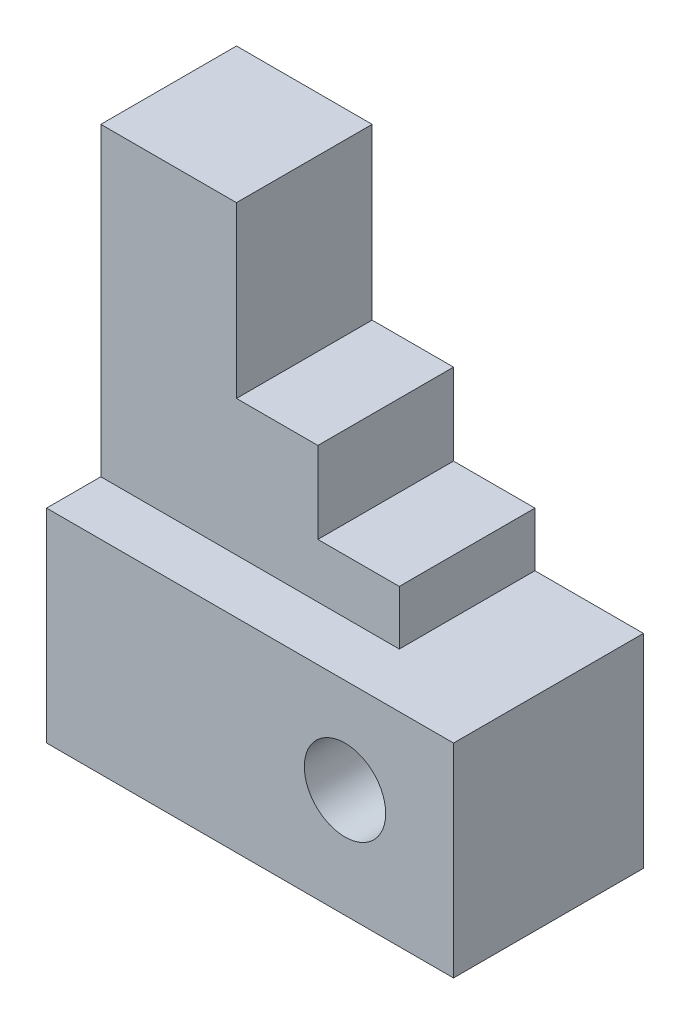
ISO-10303-21;
HEADER;
FILE_DESCRIPTION(('STEP AP214'),'2;1');
FILE_NAME('part.step','',(''),(''),'','','');
FILE_SCHEMA(('AUTOMOTIVE_DESIGN { 1 0 10303 214 1 1 1 1 }'));
ENDSEC;
DATA;
#1=APPLICATION_CONTEXT('core data for automotive mechanical design processes');
#2=APPLICATION_PROTOCOL_DEFINITION('international standard','automotive_design',2000,#1);
#3=PRODUCT_CONTEXT('',#1,'mechanical');
#4=PRODUCT('Part','Part','',(#3));
#5=PRODUCT_RELATED_PRODUCT_CATEGORY('part','',(#4));
#6=PRODUCT_DEFINITION_FORMATION('','',#4);
#7=PRODUCT_DEFINITION_CONTEXT('part definition',#1,'design');
#8=PRODUCT_DEFINITION('design','',#6,#7);
#9=PRODUCT_DEFINITION_SHAPE('','',#8);
#10=(LENGTH_UNIT() NAMED_UNIT(*) SI_UNIT(.MILLI.,.METRE.));
#11=(NAMED_UNIT(*) PLANE_ANGLE_UNIT() SI_UNIT($,.RADIAN.));
#12=(NAMED_UNIT(*) SI_UNIT($,.STERADIAN.) SOLID_ANGLE_UNIT());
#13=UNCERTAINTY_MEASURE_WITH_UNIT(LENGTH_MEASURE(1.E-05),#10,'distance_accuracy_value','');
#14=(GEOMETRIC_REPRESENTATION_CONTEXT(3) GLOBAL_UNCERTAINTY_ASSIGNED_CONTEXT((#13)) GLOBAL_UNIT_ASSIGNED_CONTEXT((#10,
#11,#12)) REPRESENTATION_CONTEXT('',''));
#15=CARTESIAN_POINT('',(0.,0.,0.));
#16=DIRECTION('',(0.,0.,1.));
#17=DIRECTION('',(1.,0.,0.));
#18=AXIS2_PLACEMENT_3D('',#15,#16,#17);
#19=CARTESIAN_POINT('',(0.,30.,28.));
#20=DIRECTION('',(0.,-1.,0.));
#21=DIRECTION('',(0.,0.,-1.));
#22=AXIS2_PLACEMENT_3D('',#19,#20,#21);
#23=PLANE('',#22);
#24=DIRECTION('',(0.,0.,-1.));
#25=VECTOR('',#24,1.);
#26=CARTESIAN_POINT('',(44.,30.,20.));
#27=LINE('',#26,#25);
#28=CARTESIAN_POINT('',(44.,30.,20.));
#29=VERTEX_POINT('',#28);
#30=CARTESIAN_POINT('',(44.,30.,0.));
#31=VERTEX_POINT('',#30);
#32=EDGE_CURVE('E125',#29,#31,#27,.T.);
#33=ORIENTED_EDGE('',*,*,#32,.F.);
#34=DIRECTION('',(1.,0.,0.));
#35=VECTOR('',#34,1.);
#36=CARTESIAN_POINT('',(0.,30.,20.));
#37=LINE('',#36,#35);
#38=CARTESIAN_POINT('',(0.,30.,20.));
#39=VERTEX_POINT('',#38);
#40=EDGE_CURVE('E58',#39,#29,#37,.T.);
#41=ORIENTED_EDGE('',*,*,#40,.F.);
#42=DIRECTION('',(0.,0.,-1.));
#43=VECTOR('',#42,1.);
#44=CARTESIAN_POINT('',(0.,30.,28.));
#45=LINE('',#44,#43);
#46=CARTESIAN_POINT('',(0.,30.,28.));
#47=VERTEX_POINT('',#46);
#48=EDGE_CURVE('E199',#47,#39,#45,.T.);
#49=ORIENTED_EDGE('',*,*,#48,.F.);
#50=DIRECTION('',(-1.,0.,0.));
#51=VECTOR('',#50,1.);
#52=CARTESIAN_POINT('',(0.,30.,28.));
#53=LINE('',#52,#51);
#54=CARTESIAN_POINT('',(60.,30.,28.));
#55=VERTEX_POINT('',#54);
#56=EDGE_CURVE('E197',#55,#47,#53,.T.);
#57=ORIENTED_EDGE('',*,*,#56,.F.);
#58=DIRECTION('',(0.,0.,-1.));
#59=VECTOR('',#58,1.);
#60=CARTESIAN_POINT('',(60.,30.,28.));
#61=LINE('',#60,#59);
#62=CARTESIAN_POINT('',(60.,30.,0.));
#63=VERTEX_POINT('',#62);
#64=EDGE_CURVE('E208',#55,#63,#61,.T.);
#65=ORIENTED_EDGE('',*,*,#64,.T.);
#66=DIRECTION('',(-1.,0.,0.));
#67=VECTOR('',#66,1.);
#68=CARTESIAN_POINT('',(0.,30.,0.));
#69=LINE('',#68,#67);
#70=EDGE_CURVE('E64',#63,#31,#69,.T.);
#71=ORIENTED_EDGE('',*,*,#70,.T.);
#72=EDGE_LOOP('',(#33,#41,#49,#57,#65,#71));
#73=FACE_BOUND('',#72,.T.);
#74=ADVANCED_FACE('F43',(#73),#23,.F.);
#75=CARTESIAN_POINT('',(0.,0.,28.));
#76=DIRECTION('',(0.,0.,-1.));
#77=DIRECTION('',(-1.,0.,0.));
#78=AXIS2_PLACEMENT_3D('',#75,#76,#77);
#79=PLANE('',#78);
#80=DIRECTION('',(0.,-1.,0.));
#81=VECTOR('',#80,1.);
#82=CARTESIAN_POINT('',(0.,0.,28.));
#83=LINE('',#82,#81);
#84=CARTESIAN_POINT('',(0.,0.,28.));
#85=VERTEX_POINT('',#84);
#86=EDGE_CURVE('E190',#47,#85,#83,.T.);
#87=ORIENTED_EDGE('',*,*,#86,.T.);
#88=DIRECTION('',(1.,0.,0.));
#89=VECTOR('',#88,1.);
#90=CARTESIAN_POINT('',(0.,0.,28.));
#91=LINE('',#90,#89);
#92=CARTESIAN_POINT('',(60.,0.,28.));
#93=VERTEX_POINT('',#92);
#94=EDGE_CURVE('E193',#85,#93,#91,.T.);
#95=ORIENTED_EDGE('',*,*,#94,.T.);
#96=DIRECTION('',(0.,1.,0.));
#97=VECTOR('',#96,1.);
#98=CARTESIAN_POINT('',(60.,0.,28.));
#99=LINE('',#98,#97);
#100=EDGE_CURVE('E195',#93,#55,#99,.T.);
#101=ORIENTED_EDGE('',*,*,#100,.T.);
#102=ORIENTED_EDGE('',*,*,#56,.T.);
#103=EDGE_LOOP('',(#87,#95,#101,#102));
#104=FACE_BOUND('',#103,.T.);
#105=CARTESIAN_POINT('',(44.,16.,28.));
#106=DIRECTION('',(0.,0.,1.));
#107=DIRECTION('',(1.,0.,0.));
#108=AXIS2_PLACEMENT_3D('',#105,#106,#107);
#109=CIRCLE('',#108,5.99999999999999);
#110=CARTESIAN_POINT('',(50.,16.,28.));
#111=VERTEX_POINT('',#110);
#112=EDGE_CURVE('E184',#111,#111,#109,.T.);
#113=ORIENTED_EDGE('',*,*,#112,.F.);
#114=EDGE_LOOP('',(#113));
#115=FACE_BOUND('',#114,.T.);
#116=ADVANCED_FACE('F249',(#104,#115),#79,.F.);
#117=CARTESIAN_POINT('',(0.,0.,0.));
#118=DIRECTION('',(0.,0.,-1.));
#119=DIRECTION('',(-1.,0.,0.));
#120=AXIS2_PLACEMENT_3D('',#117,#118,#119);
#121=PLANE('',#120);
#122=DIRECTION('',(0.,-1.,0.));
#123=VECTOR('',#122,1.);
#124=CARTESIAN_POINT('',(0.,0.,0.));
#125=LINE('',#124,#123);
#126=CARTESIAN_POINT('',(0.,75.,0.));
#127=VERTEX_POINT('',#126);
#128=CARTESIAN_POINT('',(0.,0.,0.));
#129=VERTEX_POINT('',#128);
#130=EDGE_CURVE('E187',#127,#129,#125,.T.);
#131=ORIENTED_EDGE('',*,*,#130,.F.);
#132=DIRECTION('',(-1.,0.,0.));
#133=VECTOR('',#132,1.);
#134=CARTESIAN_POINT('',(0.,75.,0.));
#135=LINE('',#134,#133);
#136=CARTESIAN_POINT('',(20.,75.,0.));
#137=VERTEX_POINT('',#136);
#138=EDGE_CURVE('E143',#137,#127,#135,.T.);
#139=ORIENTED_EDGE('',*,*,#138,.F.);
#140=DIRECTION('',(0.,1.,0.));
#141=VECTOR('',#140,1.);
#142=CARTESIAN_POINT('',(20.,75.,0.));
#143=LINE('',#142,#141);
#144=CARTESIAN_POINT('',(20.,50.,0.));
#145=VERTEX_POINT('',#144);
#146=EDGE_CURVE('E146',#145,#137,#143,.T.);
#147=ORIENTED_EDGE('',*,*,#146,.F.);
#148=DIRECTION('',(-1.,0.,0.));
#149=VECTOR('',#148,1.);
#150=CARTESIAN_POINT('',(20.,50.,0.));
#151=LINE('',#150,#149);
#152=CARTESIAN_POINT('',(32.,50.,0.));
#153=VERTEX_POINT('',#152);
#154=EDGE_CURVE('E166',#153,#145,#151,.T.);
#155=ORIENTED_EDGE('',*,*,#154,.F.);
#156=DIRECTION('',(0.,1.,0.));
#157=VECTOR('',#156,1.);
#158=CARTESIAN_POINT('',(32.,50.,0.));
#159=LINE('',#158,#157);
#160=CARTESIAN_POINT('',(32.,38.,0.));
#161=VERTEX_POINT('',#160);
#162=EDGE_CURVE('E164',#161,#153,#159,.T.);
#163=ORIENTED_EDGE('',*,*,#162,.F.);
#164=DIRECTION('',(-1.,0.,0.));
#165=VECTOR('',#164,1.);
#166=CARTESIAN_POINT('',(32.,38.,0.));
#167=LINE('',#166,#165);
#168=CARTESIAN_POINT('',(44.,38.,0.));
#169=VERTEX_POINT('',#168);
#170=EDGE_CURVE('E162',#169,#161,#167,.T.);
#171=ORIENTED_EDGE('',*,*,#170,.F.);
#172=DIRECTION('',(0.,1.,0.));
#173=VECTOR('',#172,1.);
#174=CARTESIAN_POINT('',(44.,38.,0.));
#175=LINE('',#174,#173);
#176=EDGE_CURVE('E160',#31,#169,#175,.T.);
#177=ORIENTED_EDGE('',*,*,#176,.F.);
#178=ORIENTED_EDGE('',*,*,#70,.F.);
#179=DIRECTION('',(0.,1.,0.));
#180=VECTOR('',#179,1.);
#181=CARTESIAN_POINT('',(60.,0.,0.));
#182=LINE('',#181,#180);
#183=CARTESIAN_POINT('',(60.,0.,0.));
#184=VERTEX_POINT('',#183);
#185=EDGE_CURVE('E204',#184,#63,#182,.T.);
#186=ORIENTED_EDGE('',*,*,#185,.F.);
#187=DIRECTION('',(1.,0.,0.));
#188=VECTOR('',#187,1.);
#189=CARTESIAN_POINT('',(0.,0.,0.));
#190=LINE('',#189,#188);
#191=EDGE_CURVE('E202',#129,#184,#190,.T.);
#192=ORIENTED_EDGE('',*,*,#191,.F.);
#193=EDGE_LOOP('',(#131,#139,#147,#155,#163,#171,#177,#178,#186,#192));
#194=FACE_BOUND('',#193,.T.);
#195=CARTESIAN_POINT('',(44.,16.,0.));
#196=DIRECTION('',(0.,0.,1.));
#197=DIRECTION('',(1.,0.,0.));
#198=AXIS2_PLACEMENT_3D('',#195,#196,#197);
#199=CIRCLE('',#198,5.99999999999999);
#200=CARTESIAN_POINT('',(50.,16.,0.));
#201=VERTEX_POINT('',#200);
#202=EDGE_CURVE('E128',#201,#201,#199,.T.);
#203=ORIENTED_EDGE('',*,*,#202,.T.);
#204=EDGE_LOOP('',(#203));
#205=FACE_BOUND('',#204,.T.);
#206=ADVANCED_FACE('F218',(#194,#205),#121,.T.);
#207=CARTESIAN_POINT('',(0.,0.,28.));
#208=DIRECTION('',(1.,0.,0.));
#209=DIRECTION('',(0.,0.,-1.));
#210=AXIS2_PLACEMENT_3D('',#207,#208,#209);
#211=PLANE('',#210);
#212=ORIENTED_EDGE('',*,*,#130,.T.);
#213=DIRECTION('',(0.,0.,-1.));
#214=VECTOR('',#213,1.);
#215=CARTESIAN_POINT('',(0.,0.,28.));
#216=LINE('',#215,#214);
#217=EDGE_CURVE('E11',#85,#129,#216,.T.);
#218=ORIENTED_EDGE('',*,*,#217,.F.);
#219=ORIENTED_EDGE('',*,*,#86,.F.);
#220=ORIENTED_EDGE('',*,*,#48,.T.);
#221=DIRECTION('',(0.,-1.,0.));
#222=VECTOR('',#221,1.);
#223=CARTESIAN_POINT('',(0.,30.,20.));
#224=LINE('',#223,#222);
#225=CARTESIAN_POINT('',(0.,75.,20.));
#226=VERTEX_POINT('',#225);
#227=EDGE_CURVE('E142',#226,#39,#224,.T.);
#228=ORIENTED_EDGE('',*,*,#227,.F.);
#229=DIRECTION('',(0.,0.,-1.));
#230=VECTOR('',#229,1.);
#231=CARTESIAN_POINT('',(0.,75.,20.));
#232=LINE('',#231,#230);
#233=EDGE_CURVE('E159',#226,#127,#232,.T.);
#234=ORIENTED_EDGE('',*,*,#233,.T.);
#235=EDGE_LOOP('',(#212,#218,#219,#220,#228,#234));
#236=FACE_BOUND('',#235,.T.);
#237=ADVANCED_FACE('F45',(#236),#211,.F.);
#238=CARTESIAN_POINT('',(0.,0.,28.));
#239=DIRECTION('',(0.,1.,0.));
#240=DIRECTION('',(0.,0.,1.));
#241=AXIS2_PLACEMENT_3D('',#238,#239,#240);
#242=PLANE('',#241);
#243=ORIENTED_EDGE('',*,*,#191,.T.);
#244=DIRECTION('',(0.,0.,-1.));
#245=VECTOR('',#244,1.);
#246=CARTESIAN_POINT('',(60.,0.,28.));
#247=LINE('',#246,#245);
#248=EDGE_CURVE('E51',#93,#184,#247,.T.);
#249=ORIENTED_EDGE('',*,*,#248,.F.);
#250=ORIENTED_EDGE('',*,*,#94,.F.);
#251=ORIENTED_EDGE('',*,*,#217,.T.);
#252=EDGE_LOOP('',(#243,#249,#250,#251));
#253=FACE_BOUND('',#252,.T.);
#254=ADVANCED_FACE('F251',(#253),#242,.F.);
#255=CARTESIAN_POINT('',(60.,0.,28.));
#256=DIRECTION('',(-1.,0.,0.));
#257=DIRECTION('',(0.,0.,1.));
#258=AXIS2_PLACEMENT_3D('',#255,#256,#257);
#259=PLANE('',#258);
#260=ORIENTED_EDGE('',*,*,#185,.T.);
#261=ORIENTED_EDGE('',*,*,#64,.F.);
#262=ORIENTED_EDGE('',*,*,#100,.F.);
#263=ORIENTED_EDGE('',*,*,#248,.T.);
#264=EDGE_LOOP('',(#260,#261,#262,#263));
#265=FACE_BOUND('',#264,.T.);
#266=ADVANCED_FACE('F214',(#265),#259,.F.);
#267=CARTESIAN_POINT('',(44.,16.,28.));
#268=DIRECTION('',(0.,0.,-1.));
#269=DIRECTION('',(-1.,0.,0.));
#270=AXIS2_PLACEMENT_3D('',#267,#268,#269);
#271=CYLINDRICAL_SURFACE('',#270,5.99999999999999);
#272=ORIENTED_EDGE('',*,*,#112,.T.);
#273=EDGE_LOOP('',(#272));
#274=FACE_BOUND('',#273,.T.);
#275=ORIENTED_EDGE('',*,*,#202,.F.);
#276=EDGE_LOOP('',(#275));
#277=FACE_BOUND('',#276,.T.);
#278=ADVANCED_FACE('F257',(#274,#277),#271,.F.);
#279=CARTESIAN_POINT('',(44.,38.,20.));
#280=DIRECTION('',(-1.,0.,0.));
#281=DIRECTION('',(0.,-1.,0.));
#282=AXIS2_PLACEMENT_3D('',#279,#280,#281);
#283=PLANE('',#282);
#284=ORIENTED_EDGE('',*,*,#176,.T.);
#285=DIRECTION('',(0.,0.,-1.));
#286=VECTOR('',#285,1.);
#287=CARTESIAN_POINT('',(44.,38.,20.));
#288=LINE('',#287,#286);
#289=CARTESIAN_POINT('',(44.,38.,20.));
#290=VERTEX_POINT('',#289);
#291=EDGE_CURVE('E129',#290,#169,#288,.T.);
#292=ORIENTED_EDGE('',*,*,#291,.F.);
#293=DIRECTION('',(0.,1.,0.));
#294=VECTOR('',#293,1.);
#295=CARTESIAN_POINT('',(44.,38.,20.));
#296=LINE('',#295,#294);
#297=EDGE_CURVE('E132',#29,#290,#296,.T.);
#298=ORIENTED_EDGE('',*,*,#297,.F.);
#299=ORIENTED_EDGE('',*,*,#32,.T.);
#300=EDGE_LOOP('',(#284,#292,#298,#299));
#301=FACE_BOUND('',#300,.T.);
#302=ADVANCED_FACE('F133',(#301),#283,.F.);
#303=CARTESIAN_POINT('',(32.,38.,20.));
#304=DIRECTION('',(0.,-1.,0.));
#305=DIRECTION('',(0.,0.,-1.));
#306=AXIS2_PLACEMENT_3D('',#303,#304,#305);
#307=PLANE('',#306);
#308=ORIENTED_EDGE('',*,*,#170,.T.);
#309=DIRECTION('',(0.,0.,-1.));
#310=VECTOR('',#309,1.);
#311=CARTESIAN_POINT('',(32.,38.,20.));
#312=LINE('',#311,#310);
#313=CARTESIAN_POINT('',(32.,38.,20.));
#314=VERTEX_POINT('',#313);
#315=EDGE_CURVE('E180',#314,#161,#312,.T.);
#316=ORIENTED_EDGE('',*,*,#315,.F.);
#317=DIRECTION('',(-1.,0.,0.));
#318=VECTOR('',#317,1.);
#319=CARTESIAN_POINT('',(32.,38.,20.));
#320=LINE('',#319,#318);
#321=EDGE_CURVE('E137',#290,#314,#320,.T.);
#322=ORIENTED_EDGE('',*,*,#321,.F.);
#323=ORIENTED_EDGE('',*,*,#291,.T.);
#324=EDGE_LOOP('',(#308,#316,#322,#323));
#325=FACE_BOUND('',#324,.T.);
#326=ADVANCED_FACE('F223',(#325),#307,.F.);
#327=CARTESIAN_POINT('',(32.,50.,20.));
#328=DIRECTION('',(-1.,0.,0.));
#329=DIRECTION('',(0.,0.,1.));
#330=AXIS2_PLACEMENT_3D('',#327,#328,#329);
#331=PLANE('',#330);
#332=ORIENTED_EDGE('',*,*,#162,.T.);
#333=DIRECTION('',(0.,0.,-1.));
#334=VECTOR('',#333,1.);
#335=CARTESIAN_POINT('',(32.,50.,20.));
#336=LINE('',#335,#334);
#337=CARTESIAN_POINT('',(32.,50.,20.));
#338=VERTEX_POINT('',#337);
#339=EDGE_CURVE('E177',#338,#153,#336,.T.);
#340=ORIENTED_EDGE('',*,*,#339,.F.);
#341=DIRECTION('',(0.,1.,0.));
#342=VECTOR('',#341,1.);
#343=CARTESIAN_POINT('',(32.,50.,20.));
#344=LINE('',#343,#342);
#345=EDGE_CURVE('E150',#314,#338,#344,.T.);
#346=ORIENTED_EDGE('',*,*,#345,.F.);
#347=ORIENTED_EDGE('',*,*,#315,.T.);
#348=EDGE_LOOP('',(#332,#340,#346,#347));
#349=FACE_BOUND('',#348,.T.);
#350=ADVANCED_FACE('F230',(#349),#331,.F.);
#351=CARTESIAN_POINT('',(20.,50.,20.));
#352=DIRECTION('',(0.,-1.,0.));
#353=DIRECTION('',(0.,0.,-1.));
#354=AXIS2_PLACEMENT_3D('',#351,#352,#353);
#355=PLANE('',#354);
#356=ORIENTED_EDGE('',*,*,#154,.T.);
#357=DIRECTION('',(0.,0.,-1.));
#358=VECTOR('',#357,1.);
#359=CARTESIAN_POINT('',(20.,50.,20.));
#360=LINE('',#359,#358);
#361=CARTESIAN_POINT('',(20.,50.,20.));
#362=VERTEX_POINT('',#361);
#363=EDGE_CURVE('E174',#362,#145,#360,.T.);
#364=ORIENTED_EDGE('',*,*,#363,.F.);
#365=DIRECTION('',(-1.,0.,0.));
#366=VECTOR('',#365,1.);
#367=CARTESIAN_POINT('',(20.,50.,20.));
#368=LINE('',#367,#366);
#369=EDGE_CURVE('E152',#338,#362,#368,.T.);
#370=ORIENTED_EDGE('',*,*,#369,.F.);
#371=ORIENTED_EDGE('',*,*,#339,.T.);
#372=EDGE_LOOP('',(#356,#364,#370,#371));
#373=FACE_BOUND('',#372,.T.);
#374=ADVANCED_FACE('F233',(#373),#355,.F.);
#375=CARTESIAN_POINT('',(20.,75.,20.));
#376=DIRECTION('',(-1.,0.,0.));
#377=DIRECTION('',(0.,-1.,0.));
#378=AXIS2_PLACEMENT_3D('',#375,#376,#377);
#379=PLANE('',#378);
#380=ORIENTED_EDGE('',*,*,#146,.T.);
#381=DIRECTION('',(0.,0.,-1.));
#382=VECTOR('',#381,1.);
#383=CARTESIAN_POINT('',(20.,75.,20.));
#384=LINE('',#383,#382);
#385=CARTESIAN_POINT('',(20.,75.,20.));
#386=VERTEX_POINT('',#385);
#387=EDGE_CURVE('E171',#386,#137,#384,.T.);
#388=ORIENTED_EDGE('',*,*,#387,.F.);
#389=DIRECTION('',(0.,1.,0.));
#390=VECTOR('',#389,1.);
#391=CARTESIAN_POINT('',(20.,75.,20.));
#392=LINE('',#391,#390);
#393=EDGE_CURVE('E154',#362,#386,#392,.T.);
#394=ORIENTED_EDGE('',*,*,#393,.F.);
#395=ORIENTED_EDGE('',*,*,#363,.T.);
#396=EDGE_LOOP('',(#380,#388,#394,#395));
#397=FACE_BOUND('',#396,.T.);
#398=ADVANCED_FACE('F238',(#397),#379,.F.);
#399=CARTESIAN_POINT('',(0.,75.,20.));
#400=DIRECTION('',(0.,-1.,0.));
#401=DIRECTION('',(0.,0.,-1.));
#402=AXIS2_PLACEMENT_3D('',#399,#400,#401);
#403=PLANE('',#402);
#404=ORIENTED_EDGE('',*,*,#138,.T.);
#405=ORIENTED_EDGE('',*,*,#233,.F.);
#406=DIRECTION('',(-1.,0.,0.));
#407=VECTOR('',#406,1.);
#408=CARTESIAN_POINT('',(0.,75.,20.));
#409=LINE('',#408,#407);
#410=EDGE_CURVE('E156',#386,#226,#409,.T.);
#411=ORIENTED_EDGE('',*,*,#410,.F.);
#412=ORIENTED_EDGE('',*,*,#387,.T.);
#413=EDGE_LOOP('',(#404,#405,#411,#412));
#414=FACE_BOUND('',#413,.T.);
#415=ADVANCED_FACE('F242',(#414),#403,.F.);
#416=CARTESIAN_POINT('',(0.,0.,20.));
#417=DIRECTION('',(0.,0.,-1.));
#418=DIRECTION('',(-1.,0.,0.));
#419=AXIS2_PLACEMENT_3D('',#416,#417,#418);
#420=PLANE('',#419);
#421=ORIENTED_EDGE('',*,*,#40,.T.);
#422=ORIENTED_EDGE('',*,*,#297,.T.);
#423=ORIENTED_EDGE('',*,*,#321,.T.);
#424=ORIENTED_EDGE('',*,*,#345,.T.);
#425=ORIENTED_EDGE('',*,*,#369,.T.);
#426=ORIENTED_EDGE('',*,*,#393,.T.);
#427=ORIENTED_EDGE('',*,*,#410,.T.);
#428=ORIENTED_EDGE('',*,*,#227,.T.);
#429=EDGE_LOOP('',(#421,#422,#423,#424,#425,#426,#427,#428));
#430=FACE_BOUND('',#429,.T.);
#431=ADVANCED_FACE('F140',(#430),#420,.F.);
#432=CLOSED_SHELL('',(#74,#116,#206,#237,#254,#266,#278,#302,#326,#350,#374,#398,#415,#431));
#433=MANIFOLD_SOLID_BREP('B2',#432);
#434=ADVANCED_BREP_SHAPE_REPRESENTATION('',(#18,#433),#14);
#435=SHAPE_DEFINITION_REPRESENTATION(#9,#434);
ENDSEC;
END-ISO-10303-21;
